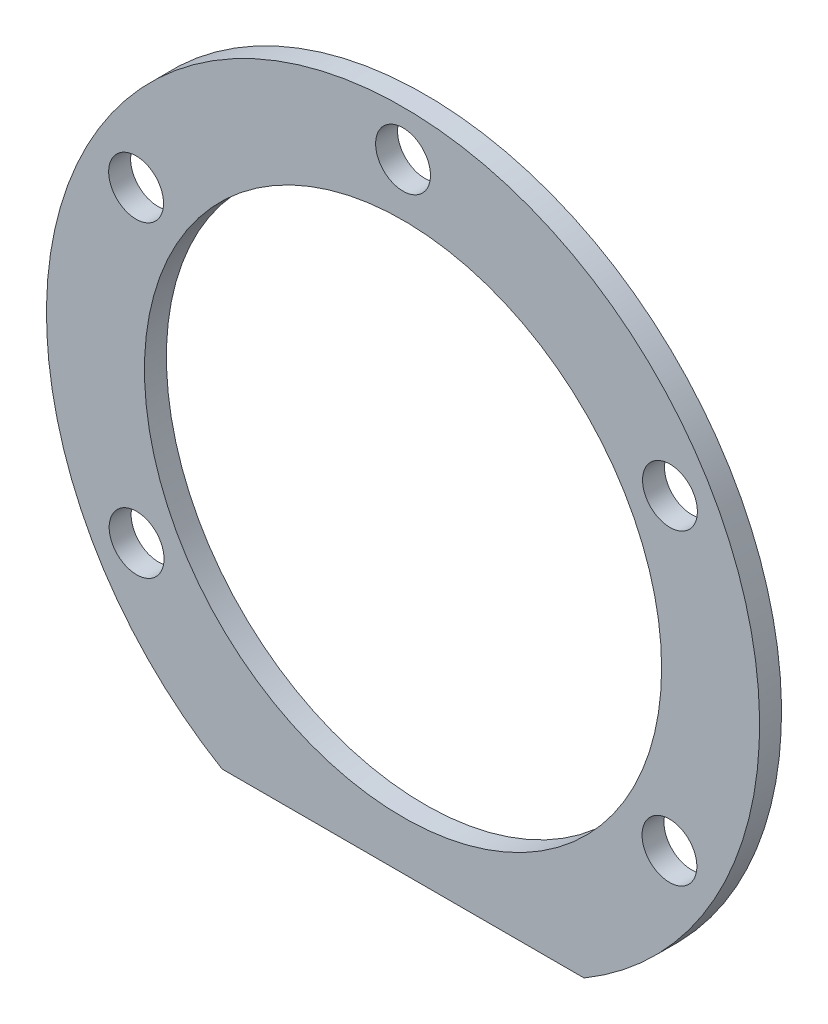
ISO-10303-21;
HEADER;
FILE_DESCRIPTION(('STEP AP214'),'2;1');
FILE_NAME('part.step','',(''),(''),'','','');
FILE_SCHEMA(('AUTOMOTIVE_DESIGN { 1 0 10303 214 1 1 1 1 }'));
ENDSEC;
DATA;
#1=APPLICATION_CONTEXT('core data for automotive mechanical design processes');
#2=APPLICATION_PROTOCOL_DEFINITION('international standard','automotive_design',2000,#1);
#3=PRODUCT_CONTEXT('',#1,'mechanical');
#4=PRODUCT('Part','Part','',(#3));
#5=PRODUCT_RELATED_PRODUCT_CATEGORY('part','',(#4));
#6=PRODUCT_DEFINITION_FORMATION('','',#4);
#7=PRODUCT_DEFINITION_CONTEXT('part definition',#1,'design');
#8=PRODUCT_DEFINITION('design','',#6,#7);
#9=PRODUCT_DEFINITION_SHAPE('','',#8);
#10=(LENGTH_UNIT() NAMED_UNIT(*) SI_UNIT(.MILLI.,.METRE.));
#11=(NAMED_UNIT(*) PLANE_ANGLE_UNIT() SI_UNIT($,.RADIAN.));
#12=(NAMED_UNIT(*) SI_UNIT($,.STERADIAN.) SOLID_ANGLE_UNIT());
#13=UNCERTAINTY_MEASURE_WITH_UNIT(LENGTH_MEASURE(1.E-05),#10,'distance_accuracy_value','');
#14=(GEOMETRIC_REPRESENTATION_CONTEXT(3) GLOBAL_UNCERTAINTY_ASSIGNED_CONTEXT((#13)) GLOBAL_UNIT_ASSIGNED_CONTEXT((#10,
#11,#12)) REPRESENTATION_CONTEXT('',''));
#15=CARTESIAN_POINT('',(0.,0.,0.));
#16=DIRECTION('',(0.,0.,1.));
#17=DIRECTION('',(1.,0.,0.));
#18=AXIS2_PLACEMENT_3D('',#15,#16,#17);
#19=CARTESIAN_POINT('',(0.,0.,5.));
#20=DIRECTION('',(0.,0.,1.));
#21=DIRECTION('',(1.,0.,0.));
#22=AXIS2_PLACEMENT_3D('',#19,#20,#21);
#23=PLANE('',#22);
#24=CARTESIAN_POINT('',(-24.3294718397256,13.98,5.));
#25=DIRECTION('',(0.,0.,1.));
#26=DIRECTION('',(1.,0.,0.));
#27=AXIS2_PLACEMENT_3D('',#24,#25,#26);
#28=CIRCLE('',#27,2.5);
#29=CARTESIAN_POINT('',(-21.8294718397256,13.98,5.));
#30=VERTEX_POINT('',#29);
#31=EDGE_CURVE('E105',#30,#30,#28,.T.);
#32=ORIENTED_EDGE('',*,*,#31,.F.);
#33=EDGE_LOOP('',(#32));
#34=FACE_BOUND('',#33,.T.);
#35=CARTESIAN_POINT('',(24.3294718397256,13.98,5.));
#36=DIRECTION('',(0.,0.,1.));
#37=DIRECTION('',(1.,0.,0.));
#38=AXIS2_PLACEMENT_3D('',#35,#36,#37);
#39=CIRCLE('',#38,2.5);
#40=CARTESIAN_POINT('',(26.8294718397256,13.98,5.));
#41=VERTEX_POINT('',#40);
#42=EDGE_CURVE('E97',#41,#41,#39,.T.);
#43=ORIENTED_EDGE('',*,*,#42,.F.);
#44=EDGE_LOOP('',(#43));
#45=FACE_BOUND('',#44,.T.);
#46=CARTESIAN_POINT('',(0.,0.,5.));
#47=DIRECTION('',(0.,0.,1.));
#48=DIRECTION('',(1.,0.,0.));
#49=AXIS2_PLACEMENT_3D('',#46,#47,#48);
#50=CIRCLE('',#49,23.57);
#51=CARTESIAN_POINT('',(23.57,0.,5.));
#52=VERTEX_POINT('',#51);
#53=EDGE_CURVE('E85',#52,#52,#50,.T.);
#54=ORIENTED_EDGE('',*,*,#53,.F.);
#55=EDGE_LOOP('',(#54));
#56=FACE_BOUND('',#55,.T.);
#57=CARTESIAN_POINT('',(0.,0.,5.));
#58=DIRECTION('',(0.,0.,1.));
#59=DIRECTION('',(1.,0.,0.));
#60=AXIS2_PLACEMENT_3D('',#57,#58,#59);
#61=CIRCLE('',#60,32.5);
#62=CARTESIAN_POINT('',(16.5,-28.,5.));
#63=VERTEX_POINT('',#62);
#64=CARTESIAN_POINT('',(-16.5,-28.,5.));
#65=VERTEX_POINT('',#64);
#66=EDGE_CURVE('E81',#63,#65,#61,.T.);
#67=ORIENTED_EDGE('',*,*,#66,.T.);
#68=DIRECTION('',(1.,0.,0.));
#69=VECTOR('',#68,1.);
#70=CARTESIAN_POINT('',(-16.5,-28.,5.));
#71=LINE('',#70,#69);
#72=EDGE_CURVE('E61',#65,#63,#71,.T.);
#73=ORIENTED_EDGE('',*,*,#72,.T.);
#74=EDGE_LOOP('',(#67,#73));
#75=FACE_BOUND('',#74,.T.);
#76=CARTESIAN_POINT('',(24.2833276138177,-14.06,5.));
#77=DIRECTION('',(0.,0.,1.));
#78=DIRECTION('',(1.,0.,0.));
#79=AXIS2_PLACEMENT_3D('',#76,#77,#78);
#80=CIRCLE('',#79,2.5);
#81=CARTESIAN_POINT('',(26.7833276138177,-14.06,5.));
#82=VERTEX_POINT('',#81);
#83=EDGE_CURVE('E89',#82,#82,#80,.T.);
#84=ORIENTED_EDGE('',*,*,#83,.F.);
#85=EDGE_LOOP('',(#84));
#86=FACE_BOUND('',#85,.T.);
#87=CARTESIAN_POINT('',(0.,28.3584208479191,5.));
#88=DIRECTION('',(0.,0.,1.));
#89=DIRECTION('',(1.,0.,0.));
#90=AXIS2_PLACEMENT_3D('',#87,#88,#89);
#91=CIRCLE('',#90,2.5);
#92=CARTESIAN_POINT('',(2.5,28.3584208479191,5.));
#93=VERTEX_POINT('',#92);
#94=EDGE_CURVE('E101',#93,#93,#91,.T.);
#95=ORIENTED_EDGE('',*,*,#94,.F.);
#96=EDGE_LOOP('',(#95));
#97=FACE_BOUND('',#96,.T.);
#98=CARTESIAN_POINT('',(-24.2833276138177,-14.06,5.));
#99=DIRECTION('',(0.,0.,1.));
#100=DIRECTION('',(1.,0.,0.));
#101=AXIS2_PLACEMENT_3D('',#98,#99,#100);
#102=CIRCLE('',#101,2.5);
#103=CARTESIAN_POINT('',(-21.7833276138177,-14.06,5.));
#104=VERTEX_POINT('',#103);
#105=EDGE_CURVE('E71',#104,#104,#102,.T.);
#106=ORIENTED_EDGE('',*,*,#105,.F.);
#107=EDGE_LOOP('',(#106));
#108=FACE_BOUND('',#107,.T.);
#109=ADVANCED_FACE('F38',(#34,#45,#56,#75,#86,#97,#108),#23,.T.);
#110=CARTESIAN_POINT('',(0.,0.,5.));
#111=DIRECTION('',(0.,0.,-1.));
#112=DIRECTION('',(-1.,0.,0.));
#113=AXIS2_PLACEMENT_3D('',#110,#111,#112);
#114=CYLINDRICAL_SURFACE('',#113,32.5);
#115=DIRECTION('',(0.,0.,-1.));
#116=VECTOR('',#115,1.);
#117=CARTESIAN_POINT('',(16.5,-28.,5.));
#118=LINE('',#117,#116);
#119=CARTESIAN_POINT('',(16.5,-28.,3.));
#120=VERTEX_POINT('',#119);
#121=EDGE_CURVE('E48',#63,#120,#118,.T.);
#122=ORIENTED_EDGE('',*,*,#121,.T.);
#123=CARTESIAN_POINT('',(0.,0.,3.));
#124=DIRECTION('',(0.,0.,1.));
#125=DIRECTION('',(1.,0.,0.));
#126=AXIS2_PLACEMENT_3D('',#123,#124,#125);
#127=CIRCLE('',#126,32.5);
#128=CARTESIAN_POINT('',(-16.5,-28.,3.));
#129=VERTEX_POINT('',#128);
#130=EDGE_CURVE('E54',#120,#129,#127,.T.);
#131=ORIENTED_EDGE('',*,*,#130,.T.);
#132=DIRECTION('',(0.,0.,-1.));
#133=VECTOR('',#132,1.);
#134=CARTESIAN_POINT('',(-16.5,-28.,5.));
#135=LINE('',#134,#133);
#136=EDGE_CURVE('E11',#65,#129,#135,.T.);
#137=ORIENTED_EDGE('',*,*,#136,.F.);
#138=ORIENTED_EDGE('',*,*,#66,.F.);
#139=EDGE_LOOP('',(#122,#131,#137,#138));
#140=FACE_BOUND('',#139,.T.);
#141=ADVANCED_FACE('F40',(#140),#114,.T.);
#142=CARTESIAN_POINT('',(-16.5,-28.,5.));
#143=DIRECTION('',(0.,1.,0.));
#144=DIRECTION('',(0.,0.,1.));
#145=AXIS2_PLACEMENT_3D('',#142,#143,#144);
#146=PLANE('',#145);
#147=ORIENTED_EDGE('',*,*,#136,.T.);
#148=DIRECTION('',(-1.,0.,0.));
#149=VECTOR('',#148,1.);
#150=CARTESIAN_POINT('',(-32.5,-28.,3.));
#151=LINE('',#150,#149);
#152=EDGE_CURVE('E74',#120,#129,#151,.T.);
#153=ORIENTED_EDGE('',*,*,#152,.F.);
#154=ORIENTED_EDGE('',*,*,#121,.F.);
#155=ORIENTED_EDGE('',*,*,#72,.F.);
#156=EDGE_LOOP('',(#147,#153,#154,#155));
#157=FACE_BOUND('',#156,.T.);
#158=ADVANCED_FACE('F79',(#157),#146,.F.);
#159=CARTESIAN_POINT('',(0.,0.,5.));
#160=DIRECTION('',(0.,0.,-1.));
#161=DIRECTION('',(-1.,0.,0.));
#162=AXIS2_PLACEMENT_3D('',#159,#160,#161);
#163=CYLINDRICAL_SURFACE('',#162,23.57);
#164=CARTESIAN_POINT('',(0.,0.,3.));
#165=DIRECTION('',(0.,0.,1.));
#166=DIRECTION('',(1.,0.,0.));
#167=AXIS2_PLACEMENT_3D('',#164,#165,#166);
#168=CIRCLE('',#167,23.57);
#169=CARTESIAN_POINT('',(23.57,0.,3.00000000000001));
#170=VERTEX_POINT('',#169);
#171=EDGE_CURVE('E72',#170,#170,#168,.T.);
#172=ORIENTED_EDGE('',*,*,#171,.F.);
#173=EDGE_LOOP('',(#172));
#174=FACE_BOUND('',#173,.T.);
#175=ORIENTED_EDGE('',*,*,#53,.T.);
#176=EDGE_LOOP('',(#175));
#177=FACE_BOUND('',#176,.T.);
#178=ADVANCED_FACE('F154',(#174,#177),#163,.F.);
#179=CARTESIAN_POINT('',(24.2833276138177,-14.06,5.));
#180=DIRECTION('',(0.,0.,-1.));
#181=DIRECTION('',(-1.,0.,0.));
#182=AXIS2_PLACEMENT_3D('',#179,#180,#181);
#183=CYLINDRICAL_SURFACE('',#182,2.5);
#184=CARTESIAN_POINT('',(24.2833276138177,-14.06,3.00000000000001));
#185=DIRECTION('',(0.,0.,1.));
#186=DIRECTION('',(1.,0.,0.));
#187=AXIS2_PLACEMENT_3D('',#184,#185,#186);
#188=CIRCLE('',#187,2.5);
#189=CARTESIAN_POINT('',(26.7833276138177,-14.06,3.00000000000001));
#190=VERTEX_POINT('',#189);
#191=EDGE_CURVE('E115',#190,#190,#188,.T.);
#192=ORIENTED_EDGE('',*,*,#191,.F.);
#193=EDGE_LOOP('',(#192));
#194=FACE_BOUND('',#193,.T.);
#195=ORIENTED_EDGE('',*,*,#83,.T.);
#196=EDGE_LOOP('',(#195));
#197=FACE_BOUND('',#196,.T.);
#198=ADVANCED_FACE('F160',(#194,#197),#183,.F.);
#199=CARTESIAN_POINT('',(24.3294718397256,13.98,5.));
#200=DIRECTION('',(0.,0.,-1.));
#201=DIRECTION('',(-1.,0.,0.));
#202=AXIS2_PLACEMENT_3D('',#199,#200,#201);
#203=CYLINDRICAL_SURFACE('',#202,2.5);
#204=CARTESIAN_POINT('',(24.3294718397256,13.98,3.00000000000001));
#205=DIRECTION('',(0.,0.,1.));
#206=DIRECTION('',(1.,0.,0.));
#207=AXIS2_PLACEMENT_3D('',#204,#205,#206);
#208=CIRCLE('',#207,2.5);
#209=CARTESIAN_POINT('',(26.8294718397256,13.98,3.00000000000001));
#210=VERTEX_POINT('',#209);
#211=EDGE_CURVE('E119',#210,#210,#208,.T.);
#212=ORIENTED_EDGE('',*,*,#211,.F.);
#213=EDGE_LOOP('',(#212));
#214=FACE_BOUND('',#213,.T.);
#215=ORIENTED_EDGE('',*,*,#42,.T.);
#216=EDGE_LOOP('',(#215));
#217=FACE_BOUND('',#216,.T.);
#218=ADVANCED_FACE('F165',(#214,#217),#203,.F.);
#219=CARTESIAN_POINT('',(0.,28.3584208479191,5.));
#220=DIRECTION('',(0.,0.,-1.));
#221=DIRECTION('',(-1.,0.,0.));
#222=AXIS2_PLACEMENT_3D('',#219,#220,#221);
#223=CYLINDRICAL_SURFACE('',#222,2.5);
#224=CARTESIAN_POINT('',(0.,28.3584208479191,3.));
#225=DIRECTION('',(0.,0.,1.));
#226=DIRECTION('',(1.,0.,0.));
#227=AXIS2_PLACEMENT_3D('',#224,#225,#226);
#228=CIRCLE('',#227,2.5);
#229=CARTESIAN_POINT('',(2.5,28.3584208479191,3.));
#230=VERTEX_POINT('',#229);
#231=EDGE_CURVE('E123',#230,#230,#228,.T.);
#232=ORIENTED_EDGE('',*,*,#231,.F.);
#233=EDGE_LOOP('',(#232));
#234=FACE_BOUND('',#233,.T.);
#235=ORIENTED_EDGE('',*,*,#94,.T.);
#236=EDGE_LOOP('',(#235));
#237=FACE_BOUND('',#236,.T.);
#238=ADVANCED_FACE('F181',(#234,#237),#223,.F.);
#239=CARTESIAN_POINT('',(-24.3294718397256,13.98,5.));
#240=DIRECTION('',(0.,0.,-1.));
#241=DIRECTION('',(-1.,0.,0.));
#242=AXIS2_PLACEMENT_3D('',#239,#240,#241);
#243=CYLINDRICAL_SURFACE('',#242,2.5);
#244=CARTESIAN_POINT('',(-24.3294718397256,13.98,3.));
#245=DIRECTION('',(0.,0.,1.));
#246=DIRECTION('',(1.,0.,0.));
#247=AXIS2_PLACEMENT_3D('',#244,#245,#246);
#248=CIRCLE('',#247,2.5);
#249=CARTESIAN_POINT('',(-21.8294718397256,13.98,3.));
#250=VERTEX_POINT('',#249);
#251=EDGE_CURVE('E127',#250,#250,#248,.T.);
#252=ORIENTED_EDGE('',*,*,#251,.F.);
#253=EDGE_LOOP('',(#252));
#254=FACE_BOUND('',#253,.T.);
#255=ORIENTED_EDGE('',*,*,#31,.T.);
#256=EDGE_LOOP('',(#255));
#257=FACE_BOUND('',#256,.T.);
#258=ADVANCED_FACE('F140',(#254,#257),#243,.F.);
#259=CARTESIAN_POINT('',(-24.2833276138177,-14.06,5.));
#260=DIRECTION('',(0.,0.,-1.));
#261=DIRECTION('',(-1.,0.,0.));
#262=AXIS2_PLACEMENT_3D('',#259,#260,#261);
#263=CYLINDRICAL_SURFACE('',#262,2.5);
#264=CARTESIAN_POINT('',(-24.2833276138177,-14.06,3.));
#265=DIRECTION('',(0.,0.,1.));
#266=DIRECTION('',(1.,0.,0.));
#267=AXIS2_PLACEMENT_3D('',#264,#265,#266);
#268=CIRCLE('',#267,2.5);
#269=CARTESIAN_POINT('',(-21.7833276138177,-14.06,3.));
#270=VERTEX_POINT('',#269);
#271=EDGE_CURVE('E42',#270,#270,#268,.T.);
#272=ORIENTED_EDGE('',*,*,#271,.F.);
#273=EDGE_LOOP('',(#272));
#274=FACE_BOUND('',#273,.T.);
#275=ORIENTED_EDGE('',*,*,#105,.T.);
#276=EDGE_LOOP('',(#275));
#277=FACE_BOUND('',#276,.T.);
#278=ADVANCED_FACE('F137',(#274,#277),#263,.F.);
#279=CARTESIAN_POINT('',(-32.5,42.,3.));
#280=DIRECTION('',(0.,0.,1.));
#281=DIRECTION('',(1.,0.,0.));
#282=AXIS2_PLACEMENT_3D('',#279,#280,#281);
#283=PLANE('',#282);
#284=ORIENTED_EDGE('',*,*,#171,.T.);
#285=EDGE_LOOP('',(#284));
#286=FACE_BOUND('',#285,.T.);
#287=ORIENTED_EDGE('',*,*,#191,.T.);
#288=EDGE_LOOP('',(#287));
#289=FACE_BOUND('',#288,.T.);
#290=ORIENTED_EDGE('',*,*,#211,.T.);
#291=EDGE_LOOP('',(#290));
#292=FACE_BOUND('',#291,.T.);
#293=ORIENTED_EDGE('',*,*,#231,.T.);
#294=EDGE_LOOP('',(#293));
#295=FACE_BOUND('',#294,.T.);
#296=ORIENTED_EDGE('',*,*,#251,.T.);
#297=EDGE_LOOP('',(#296));
#298=FACE_BOUND('',#297,.T.);
#299=ORIENTED_EDGE('',*,*,#271,.T.);
#300=EDGE_LOOP('',(#299));
#301=FACE_BOUND('',#300,.T.);
#302=ORIENTED_EDGE('',*,*,#130,.F.);
#303=ORIENTED_EDGE('',*,*,#152,.T.);
#304=EDGE_LOOP('',(#302,#303));
#305=FACE_BOUND('',#304,.T.);
#306=ADVANCED_FACE('F75',(#286,#289,#292,#295,#298,#301,#305),#283,.F.);
#307=CLOSED_SHELL('',(#109,#141,#158,#178,#198,#218,#238,#258,#278,#306));
#308=MANIFOLD_SOLID_BREP('B2',#307);
#309=ADVANCED_BREP_SHAPE_REPRESENTATION('',(#18,#308),#14);
#310=SHAPE_DEFINITION_REPRESENTATION(#9,#309);
ENDSEC;
END-ISO-10303-21;
